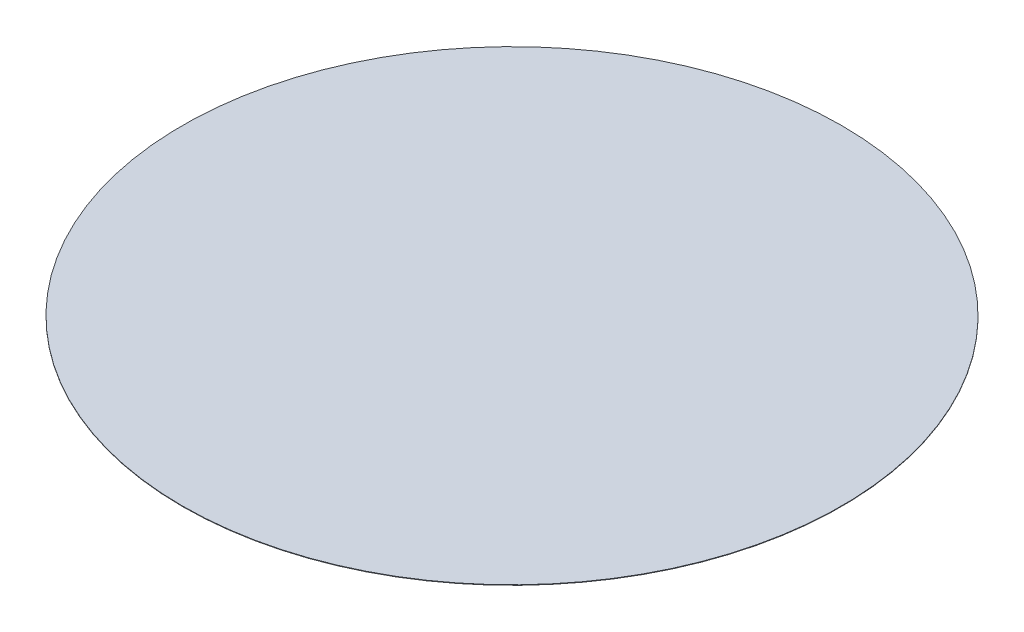
ISO-10303-21;
HEADER;
FILE_DESCRIPTION(('STEP AP214'),'2;1');
FILE_NAME('part.step','',(''),(''),'','','');
FILE_SCHEMA(('AUTOMOTIVE_DESIGN { 1 0 10303 214 1 1 1 1 }'));
ENDSEC;
DATA;
#1=APPLICATION_CONTEXT('core data for automotive mechanical design processes');
#2=APPLICATION_PROTOCOL_DEFINITION('international standard','automotive_design',2000,#1);
#3=PRODUCT_CONTEXT('',#1,'mechanical');
#4=PRODUCT('Part','Part','',(#3));
#5=PRODUCT_RELATED_PRODUCT_CATEGORY('part','',(#4));
#6=PRODUCT_DEFINITION_FORMATION('','',#4);
#7=PRODUCT_DEFINITION_CONTEXT('part definition',#1,'design');
#8=PRODUCT_DEFINITION('design','',#6,#7);
#9=PRODUCT_DEFINITION_SHAPE('','',#8);
#10=(LENGTH_UNIT() NAMED_UNIT(*) SI_UNIT(.MILLI.,.METRE.));
#11=(NAMED_UNIT(*) PLANE_ANGLE_UNIT() SI_UNIT($,.RADIAN.));
#12=(NAMED_UNIT(*) SI_UNIT($,.STERADIAN.) SOLID_ANGLE_UNIT());
#13=UNCERTAINTY_MEASURE_WITH_UNIT(LENGTH_MEASURE(1.E-05),#10,'distance_accuracy_value','');
#14=(GEOMETRIC_REPRESENTATION_CONTEXT(3) GLOBAL_UNCERTAINTY_ASSIGNED_CONTEXT((#13)) GLOBAL_UNIT_ASSIGNED_CONTEXT((#10,
#11,#12)) REPRESENTATION_CONTEXT('',''));
#15=CARTESIAN_POINT('',(0.,0.,0.));
#16=DIRECTION('',(0.,0.,1.));
#17=DIRECTION('',(1.,0.,0.));
#18=AXIS2_PLACEMENT_3D('',#15,#16,#17);
#19=CARTESIAN_POINT('',(0.,-4.,0.));
#20=DIRECTION('',(0.,1.,0.));
#21=DIRECTION('',(0.,0.,1.));
#22=AXIS2_PLACEMENT_3D('',#19,#20,#21);
#23=CYLINDRICAL_SURFACE('',#22,2750.);
#24=CARTESIAN_POINT('',(0.,-4.,0.));
#25=DIRECTION('',(0.,1.,0.));
#26=DIRECTION('',(0.,0.,1.));
#27=AXIS2_PLACEMENT_3D('',#24,#25,#26);
#28=CIRCLE('',#27,2750.);
#29=CARTESIAN_POINT('',(0.,-4.,2750.));
#30=VERTEX_POINT('',#29);
#31=EDGE_CURVE('E10',#30,#30,#28,.T.);
#32=ORIENTED_EDGE('',*,*,#31,.T.);
#33=EDGE_LOOP('',(#32));
#34=FACE_BOUND('',#33,.T.);
#35=CARTESIAN_POINT('',(0.,0.,0.));
#36=DIRECTION('',(0.,1.,0.));
#37=DIRECTION('',(0.,0.,1.));
#38=AXIS2_PLACEMENT_3D('',#35,#36,#37);
#39=CIRCLE('',#38,2750.);
#40=CARTESIAN_POINT('',(0.,0.,2750.));
#41=VERTEX_POINT('',#40);
#42=EDGE_CURVE('E37',#41,#41,#39,.T.);
#43=ORIENTED_EDGE('',*,*,#42,.F.);
#44=EDGE_LOOP('',(#43));
#45=FACE_BOUND('',#44,.T.);
#46=ADVANCED_FACE('F34',(#34,#45),#23,.T.);
#47=CARTESIAN_POINT('',(0.,-4.,0.));
#48=DIRECTION('',(0.,1.,0.));
#49=DIRECTION('',(0.,0.,1.));
#50=AXIS2_PLACEMENT_3D('',#47,#48,#49);
#51=PLANE('',#50);
#52=ORIENTED_EDGE('',*,*,#31,.F.);
#53=EDGE_LOOP('',(#52));
#54=FACE_BOUND('',#53,.T.);
#55=ADVANCED_FACE('F49',(#54),#51,.F.);
#56=CARTESIAN_POINT('',(0.,0.,0.));
#57=DIRECTION('',(0.,1.,0.));
#58=DIRECTION('',(0.,0.,1.));
#59=AXIS2_PLACEMENT_3D('',#56,#57,#58);
#60=PLANE('',#59);
#61=ORIENTED_EDGE('',*,*,#42,.T.);
#62=EDGE_LOOP('',(#61));
#63=FACE_BOUND('',#62,.T.);
#64=ADVANCED_FACE('F46',(#63),#60,.T.);
#65=CLOSED_SHELL('',(#46,#55,#64));
#66=MANIFOLD_SOLID_BREP('B2',#65);
#67=ADVANCED_BREP_SHAPE_REPRESENTATION('',(#18,#66),#14);
#68=SHAPE_DEFINITION_REPRESENTATION(#9,#67);
ENDSEC;
END-ISO-10303-21;
